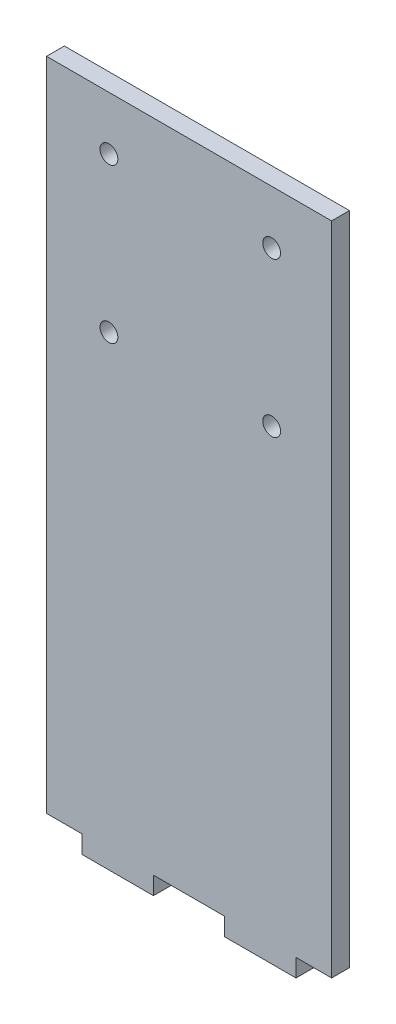
ISO-10303-21;
HEADER;
FILE_DESCRIPTION(('STEP AP214'),'2;1');
FILE_NAME('part.step','',(''),(''),'','','');
FILE_SCHEMA(('AUTOMOTIVE_DESIGN { 1 0 10303 214 1 1 1 1 }'));
ENDSEC;
DATA;
#1=APPLICATION_CONTEXT('core data for automotive mechanical design processes');
#2=APPLICATION_PROTOCOL_DEFINITION('international standard','automotive_design',2000,#1);
#3=PRODUCT_CONTEXT('',#1,'mechanical');
#4=PRODUCT('Part','Part','',(#3));
#5=PRODUCT_RELATED_PRODUCT_CATEGORY('part','',(#4));
#6=PRODUCT_DEFINITION_FORMATION('','',#4);
#7=PRODUCT_DEFINITION_CONTEXT('part definition',#1,'design');
#8=PRODUCT_DEFINITION('design','',#6,#7);
#9=PRODUCT_DEFINITION_SHAPE('','',#8);
#10=(LENGTH_UNIT() NAMED_UNIT(*) SI_UNIT(.MILLI.,.METRE.));
#11=(NAMED_UNIT(*) PLANE_ANGLE_UNIT() SI_UNIT($,.RADIAN.));
#12=(NAMED_UNIT(*) SI_UNIT($,.STERADIAN.) SOLID_ANGLE_UNIT());
#13=UNCERTAINTY_MEASURE_WITH_UNIT(LENGTH_MEASURE(1.E-05),#10,'distance_accuracy_value','');
#14=(GEOMETRIC_REPRESENTATION_CONTEXT(3) GLOBAL_UNCERTAINTY_ASSIGNED_CONTEXT((#13)) GLOBAL_UNIT_ASSIGNED_CONTEXT((#10,
#11,#12)) REPRESENTATION_CONTEXT('',''));
#15=CARTESIAN_POINT('',(0.,0.,0.));
#16=DIRECTION('',(0.,0.,1.));
#17=DIRECTION('',(1.,0.,0.));
#18=AXIS2_PLACEMENT_3D('',#15,#16,#17);
#19=CARTESIAN_POINT('',(50.8,0.,3.175));
#20=DIRECTION('',(-1.,0.,0.));
#21=DIRECTION('',(0.,-1.,0.));
#22=AXIS2_PLACEMENT_3D('',#19,#20,#21);
#23=PLANE('',#22);
#24=DIRECTION('',(0.,1.,0.));
#25=VECTOR('',#24,1.);
#26=CARTESIAN_POINT('',(50.8,0.,0.));
#27=LINE('',#26,#25);
#28=CARTESIAN_POINT('',(50.8,0.,0.));
#29=VERTEX_POINT('',#28);
#30=CARTESIAN_POINT('',(50.8,116.84,0.));
#31=VERTEX_POINT('',#30);
#32=EDGE_CURVE('E165',#29,#31,#27,.T.);
#33=ORIENTED_EDGE('',*,*,#32,.T.);
#34=DIRECTION('',(0.,0.,-1.));
#35=VECTOR('',#34,1.);
#36=CARTESIAN_POINT('',(50.8,116.84,3.175));
#37=LINE('',#36,#35);
#38=CARTESIAN_POINT('',(50.8,116.84,3.175));
#39=VERTEX_POINT('',#38);
#40=EDGE_CURVE('E11',#39,#31,#37,.T.);
#41=ORIENTED_EDGE('',*,*,#40,.F.);
#42=DIRECTION('',(0.,1.,0.));
#43=VECTOR('',#42,1.);
#44=CARTESIAN_POINT('',(50.8,0.,3.175));
#45=LINE('',#44,#43);
#46=CARTESIAN_POINT('',(50.8,0.,3.175));
#47=VERTEX_POINT('',#46);
#48=EDGE_CURVE('E100',#47,#39,#45,.T.);
#49=ORIENTED_EDGE('',*,*,#48,.F.);
#50=DIRECTION('',(0.,0.,-1.));
#51=VECTOR('',#50,1.);
#52=CARTESIAN_POINT('',(50.8,0.,3.175));
#53=LINE('',#52,#51);
#54=EDGE_CURVE('E149',#47,#29,#53,.T.);
#55=ORIENTED_EDGE('',*,*,#54,.T.);
#56=EDGE_LOOP('',(#33,#41,#49,#55));
#57=FACE_BOUND('',#56,.T.);
#58=ADVANCED_FACE('F35',(#57),#23,.F.);
#59=CARTESIAN_POINT('',(0.,116.84,3.175));
#60=DIRECTION('',(0.,1.,0.));
#61=DIRECTION('',(0.,0.,1.));
#62=AXIS2_PLACEMENT_3D('',#59,#60,#61);
#63=PLANE('',#62);
#64=DIRECTION('',(1.,0.,0.));
#65=VECTOR('',#64,1.);
#66=CARTESIAN_POINT('',(0.,116.84,0.));
#67=LINE('',#66,#65);
#68=CARTESIAN_POINT('',(0.,116.84,0.));
#69=VERTEX_POINT('',#68);
#70=EDGE_CURVE('E168',#69,#31,#67,.T.);
#71=ORIENTED_EDGE('',*,*,#70,.F.);
#72=DIRECTION('',(0.,0.,-1.));
#73=VECTOR('',#72,1.);
#74=CARTESIAN_POINT('',(0.,116.84,3.175));
#75=LINE('',#74,#73);
#76=CARTESIAN_POINT('',(0.,116.84,3.175));
#77=VERTEX_POINT('',#76);
#78=EDGE_CURVE('E44',#77,#69,#75,.T.);
#79=ORIENTED_EDGE('',*,*,#78,.F.);
#80=DIRECTION('',(1.,0.,0.));
#81=VECTOR('',#80,1.);
#82=CARTESIAN_POINT('',(0.,116.84,3.175));
#83=LINE('',#82,#81);
#84=EDGE_CURVE('E442',#77,#39,#83,.T.);
#85=ORIENTED_EDGE('',*,*,#84,.T.);
#86=ORIENTED_EDGE('',*,*,#40,.T.);
#87=EDGE_LOOP('',(#71,#79,#85,#86));
#88=FACE_BOUND('',#87,.T.);
#89=ADVANCED_FACE('F220',(#88),#63,.T.);
#90=CARTESIAN_POINT('',(0.,0.,3.175));
#91=DIRECTION('',(-1.,0.,0.));
#92=DIRECTION('',(0.,0.,1.));
#93=AXIS2_PLACEMENT_3D('',#90,#91,#92);
#94=PLANE('',#93);
#95=DIRECTION('',(0.,1.,0.));
#96=VECTOR('',#95,1.);
#97=CARTESIAN_POINT('',(0.,0.,0.));
#98=LINE('',#97,#96);
#99=CARTESIAN_POINT('',(0.,0.,0.));
#100=VERTEX_POINT('',#99);
#101=EDGE_CURVE('E171',#100,#69,#98,.T.);
#102=ORIENTED_EDGE('',*,*,#101,.F.);
#103=DIRECTION('',(0.,0.,-1.));
#104=VECTOR('',#103,1.);
#105=CARTESIAN_POINT('',(0.,0.,3.175));
#106=LINE('',#105,#104);
#107=CARTESIAN_POINT('',(0.,0.,3.175));
#108=VERTEX_POINT('',#107);
#109=EDGE_CURVE('E210',#108,#100,#106,.T.);
#110=ORIENTED_EDGE('',*,*,#109,.F.);
#111=DIRECTION('',(0.,1.,0.));
#112=VECTOR('',#111,1.);
#113=CARTESIAN_POINT('',(0.,0.,3.175));
#114=LINE('',#113,#112);
#115=EDGE_CURVE('E217',#108,#77,#114,.T.);
#116=ORIENTED_EDGE('',*,*,#115,.T.);
#117=ORIENTED_EDGE('',*,*,#78,.T.);
#118=EDGE_LOOP('',(#102,#110,#116,#117));
#119=FACE_BOUND('',#118,.T.);
#120=ADVANCED_FACE('F215',(#119),#94,.T.);
#121=CARTESIAN_POINT('',(0.,0.,3.175));
#122=DIRECTION('',(0.,1.,0.));
#123=DIRECTION('',(-1.,0.,0.));
#124=AXIS2_PLACEMENT_3D('',#121,#122,#123);
#125=PLANE('',#124);
#126=DIRECTION('',(1.,0.,0.));
#127=VECTOR('',#126,1.);
#128=CARTESIAN_POINT('',(0.,0.,0.));
#129=LINE('',#128,#127);
#130=CARTESIAN_POINT('',(6.35000000000001,0.,0.));
#131=VERTEX_POINT('',#130);
#132=EDGE_CURVE('E174',#100,#131,#129,.T.);
#133=ORIENTED_EDGE('',*,*,#132,.T.);
#134=DIRECTION('',(0.,0.,-1.));
#135=VECTOR('',#134,1.);
#136=CARTESIAN_POINT('',(6.35000000000001,0.,3.175));
#137=LINE('',#136,#135);
#138=CARTESIAN_POINT('',(6.35000000000001,0.,3.175));
#139=VERTEX_POINT('',#138);
#140=EDGE_CURVE('E207',#139,#131,#137,.T.);
#141=ORIENTED_EDGE('',*,*,#140,.F.);
#142=DIRECTION('',(1.,0.,0.));
#143=VECTOR('',#142,1.);
#144=CARTESIAN_POINT('',(0.,0.,3.175));
#145=LINE('',#144,#143);
#146=EDGE_CURVE('E238',#108,#139,#145,.T.);
#147=ORIENTED_EDGE('',*,*,#146,.F.);
#148=ORIENTED_EDGE('',*,*,#109,.T.);
#149=EDGE_LOOP('',(#133,#141,#147,#148));
#150=FACE_BOUND('',#149,.T.);
#151=ADVANCED_FACE('F229',(#150),#125,.F.);
#152=CARTESIAN_POINT('',(6.35000000000001,0.,3.175));
#153=DIRECTION('',(1.,0.,0.));
#154=DIRECTION('',(0.,0.,-1.));
#155=AXIS2_PLACEMENT_3D('',#152,#153,#154);
#156=PLANE('',#155);
#157=DIRECTION('',(0.,-1.,0.));
#158=VECTOR('',#157,1.);
#159=CARTESIAN_POINT('',(6.35000000000001,0.,0.));
#160=LINE('',#159,#158);
#161=CARTESIAN_POINT('',(6.35000000000001,-3.175,0.));
#162=VERTEX_POINT('',#161);
#163=EDGE_CURVE('E176',#131,#162,#160,.T.);
#164=ORIENTED_EDGE('',*,*,#163,.T.);
#165=DIRECTION('',(0.,0.,-1.));
#166=VECTOR('',#165,1.);
#167=CARTESIAN_POINT('',(6.35000000000001,-3.175,3.175));
#168=LINE('',#167,#166);
#169=CARTESIAN_POINT('',(6.35000000000001,-3.175,3.175));
#170=VERTEX_POINT('',#169);
#171=EDGE_CURVE('E204',#170,#162,#168,.T.);
#172=ORIENTED_EDGE('',*,*,#171,.F.);
#173=DIRECTION('',(0.,-1.,0.));
#174=VECTOR('',#173,1.);
#175=CARTESIAN_POINT('',(6.35000000000001,0.,3.175));
#176=LINE('',#175,#174);
#177=EDGE_CURVE('E235',#139,#170,#176,.T.);
#178=ORIENTED_EDGE('',*,*,#177,.F.);
#179=ORIENTED_EDGE('',*,*,#140,.T.);
#180=EDGE_LOOP('',(#164,#172,#178,#179));
#181=FACE_BOUND('',#180,.T.);
#182=ADVANCED_FACE('F233',(#181),#156,.F.);
#183=CARTESIAN_POINT('',(0.,-3.175,3.175));
#184=DIRECTION('',(0.,1.,0.));
#185=DIRECTION('',(0.,0.,1.));
#186=AXIS2_PLACEMENT_3D('',#183,#184,#185);
#187=PLANE('',#186);
#188=DIRECTION('',(1.,0.,0.));
#189=VECTOR('',#188,1.);
#190=CARTESIAN_POINT('',(0.,-3.175,0.));
#191=LINE('',#190,#189);
#192=CARTESIAN_POINT('',(19.05,-3.175,0.));
#193=VERTEX_POINT('',#192);
#194=EDGE_CURVE('E178',#162,#193,#191,.T.);
#195=ORIENTED_EDGE('',*,*,#194,.T.);
#196=DIRECTION('',(0.,0.,-1.));
#197=VECTOR('',#196,1.);
#198=CARTESIAN_POINT('',(19.05,-3.175,3.175));
#199=LINE('',#198,#197);
#200=CARTESIAN_POINT('',(19.05,-3.175,3.175));
#201=VERTEX_POINT('',#200);
#202=EDGE_CURVE('E201',#201,#193,#199,.T.);
#203=ORIENTED_EDGE('',*,*,#202,.F.);
#204=DIRECTION('',(1.,0.,0.));
#205=VECTOR('',#204,1.);
#206=CARTESIAN_POINT('',(0.,-3.175,3.175));
#207=LINE('',#206,#205);
#208=EDGE_CURVE('E237',#170,#201,#207,.T.);
#209=ORIENTED_EDGE('',*,*,#208,.F.);
#210=ORIENTED_EDGE('',*,*,#171,.T.);
#211=EDGE_LOOP('',(#195,#203,#209,#210));
#212=FACE_BOUND('',#211,.T.);
#213=ADVANCED_FACE('F376',(#212),#187,.F.);
#214=CARTESIAN_POINT('',(19.05,0.,3.175));
#215=DIRECTION('',(-1.,0.,0.));
#216=DIRECTION('',(0.,0.,1.));
#217=AXIS2_PLACEMENT_3D('',#214,#215,#216);
#218=PLANE('',#217);
#219=DIRECTION('',(0.,1.,0.));
#220=VECTOR('',#219,1.);
#221=CARTESIAN_POINT('',(19.05,0.,0.));
#222=LINE('',#221,#220);
#223=CARTESIAN_POINT('',(19.05,0.,0.));
#224=VERTEX_POINT('',#223);
#225=EDGE_CURVE('E180',#193,#224,#222,.T.);
#226=ORIENTED_EDGE('',*,*,#225,.T.);
#227=DIRECTION('',(0.,0.,-1.));
#228=VECTOR('',#227,1.);
#229=CARTESIAN_POINT('',(19.05,0.,3.175));
#230=LINE('',#229,#228);
#231=CARTESIAN_POINT('',(19.05,0.,3.175));
#232=VERTEX_POINT('',#231);
#233=EDGE_CURVE('E198',#232,#224,#230,.T.);
#234=ORIENTED_EDGE('',*,*,#233,.F.);
#235=DIRECTION('',(0.,1.,0.));
#236=VECTOR('',#235,1.);
#237=CARTESIAN_POINT('',(19.05,0.,3.175));
#238=LINE('',#237,#236);
#239=EDGE_CURVE('E240',#201,#232,#238,.T.);
#240=ORIENTED_EDGE('',*,*,#239,.F.);
#241=ORIENTED_EDGE('',*,*,#202,.T.);
#242=EDGE_LOOP('',(#226,#234,#240,#241));
#243=FACE_BOUND('',#242,.T.);
#244=ADVANCED_FACE('F366',(#243),#218,.F.);
#245=CARTESIAN_POINT('',(0.,0.,3.175));
#246=DIRECTION('',(0.,1.,0.));
#247=DIRECTION('',(-1.,0.,0.));
#248=AXIS2_PLACEMENT_3D('',#245,#246,#247);
#249=PLANE('',#248);
#250=DIRECTION('',(1.,0.,0.));
#251=VECTOR('',#250,1.);
#252=CARTESIAN_POINT('',(0.,0.,0.));
#253=LINE('',#252,#251);
#254=CARTESIAN_POINT('',(31.75,0.,0.));
#255=VERTEX_POINT('',#254);
#256=EDGE_CURVE('E182',#224,#255,#253,.T.);
#257=ORIENTED_EDGE('',*,*,#256,.T.);
#258=DIRECTION('',(0.,0.,-1.));
#259=VECTOR('',#258,1.);
#260=CARTESIAN_POINT('',(31.75,0.,3.175));
#261=LINE('',#260,#259);
#262=CARTESIAN_POINT('',(31.75,0.,3.175));
#263=VERTEX_POINT('',#262);
#264=EDGE_CURVE('E196',#263,#255,#261,.T.);
#265=ORIENTED_EDGE('',*,*,#264,.F.);
#266=DIRECTION('',(1.,0.,0.));
#267=VECTOR('',#266,1.);
#268=CARTESIAN_POINT('',(0.,0.,3.175));
#269=LINE('',#268,#267);
#270=EDGE_CURVE('E246',#232,#263,#269,.T.);
#271=ORIENTED_EDGE('',*,*,#270,.F.);
#272=ORIENTED_EDGE('',*,*,#233,.T.);
#273=EDGE_LOOP('',(#257,#265,#271,#272));
#274=FACE_BOUND('',#273,.T.);
#275=ADVANCED_FACE('F357',(#274),#249,.F.);
#276=CARTESIAN_POINT('',(31.75,0.,3.175));
#277=DIRECTION('',(-1.,0.,0.));
#278=DIRECTION('',(0.,-1.,0.));
#279=AXIS2_PLACEMENT_3D('',#276,#277,#278);
#280=PLANE('',#279);
#281=DIRECTION('',(0.,1.,0.));
#282=VECTOR('',#281,1.);
#283=CARTESIAN_POINT('',(31.75,0.,0.));
#284=LINE('',#283,#282);
#285=CARTESIAN_POINT('',(31.75,-3.175,0.));
#286=VERTEX_POINT('',#285);
#287=EDGE_CURVE('E185',#286,#255,#284,.T.);
#288=ORIENTED_EDGE('',*,*,#287,.F.);
#289=DIRECTION('',(0.,0.,-1.));
#290=VECTOR('',#289,1.);
#291=CARTESIAN_POINT('',(31.75,-3.175,3.175));
#292=LINE('',#291,#290);
#293=CARTESIAN_POINT('',(31.75,-3.175,3.175));
#294=VERTEX_POINT('',#293);
#295=EDGE_CURVE('E139',#294,#286,#292,.T.);
#296=ORIENTED_EDGE('',*,*,#295,.F.);
#297=DIRECTION('',(0.,1.,0.));
#298=VECTOR('',#297,1.);
#299=CARTESIAN_POINT('',(31.75,0.,3.175));
#300=LINE('',#299,#298);
#301=EDGE_CURVE('E145',#294,#263,#300,.T.);
#302=ORIENTED_EDGE('',*,*,#301,.T.);
#303=ORIENTED_EDGE('',*,*,#264,.T.);
#304=EDGE_LOOP('',(#288,#296,#302,#303));
#305=FACE_BOUND('',#304,.T.);
#306=ADVANCED_FACE('F249',(#305),#280,.T.);
#307=CARTESIAN_POINT('',(0.,-3.17500000000001,3.175));
#308=DIRECTION('',(0.,-1.,0.));
#309=DIRECTION('',(1.,0.,0.));
#310=AXIS2_PLACEMENT_3D('',#307,#308,#309);
#311=PLANE('',#310);
#312=DIRECTION('',(-1.,0.,0.));
#313=VECTOR('',#312,1.);
#314=CARTESIAN_POINT('',(0.,-3.17500000000001,0.));
#315=LINE('',#314,#313);
#316=CARTESIAN_POINT('',(44.45,-3.17499999999999,0.));
#317=VERTEX_POINT('',#316);
#318=EDGE_CURVE('E134',#317,#286,#315,.T.);
#319=ORIENTED_EDGE('',*,*,#318,.F.);
#320=DIRECTION('',(0.,0.,-1.));
#321=VECTOR('',#320,1.);
#322=CARTESIAN_POINT('',(44.45,-3.17499999999999,3.175));
#323=LINE('',#322,#321);
#324=CARTESIAN_POINT('',(44.45,-3.17499999999999,3.175));
#325=VERTEX_POINT('',#324);
#326=EDGE_CURVE('E129',#325,#317,#323,.T.);
#327=ORIENTED_EDGE('',*,*,#326,.F.);
#328=DIRECTION('',(-1.,0.,0.));
#329=VECTOR('',#328,1.);
#330=CARTESIAN_POINT('',(0.,-3.17500000000001,3.175));
#331=LINE('',#330,#329);
#332=EDGE_CURVE('E132',#325,#294,#331,.T.);
#333=ORIENTED_EDGE('',*,*,#332,.T.);
#334=ORIENTED_EDGE('',*,*,#295,.T.);
#335=EDGE_LOOP('',(#319,#327,#333,#334));
#336=FACE_BOUND('',#335,.T.);
#337=ADVANCED_FACE('F131',(#336),#311,.T.);
#338=CARTESIAN_POINT('',(44.45,0.,3.175));
#339=DIRECTION('',(1.,0.,0.));
#340=DIRECTION('',(0.,0.,-1.));
#341=AXIS2_PLACEMENT_3D('',#338,#339,#340);
#342=PLANE('',#341);
#343=DIRECTION('',(0.,-1.,0.));
#344=VECTOR('',#343,1.);
#345=CARTESIAN_POINT('',(44.45,0.,0.));
#346=LINE('',#345,#344);
#347=CARTESIAN_POINT('',(44.45,0.,0.));
#348=VERTEX_POINT('',#347);
#349=EDGE_CURVE('E189',#348,#317,#346,.T.);
#350=ORIENTED_EDGE('',*,*,#349,.F.);
#351=DIRECTION('',(0.,0.,-1.));
#352=VECTOR('',#351,1.);
#353=CARTESIAN_POINT('',(44.45,0.,3.175));
#354=LINE('',#353,#352);
#355=CARTESIAN_POINT('',(44.45,0.,3.175));
#356=VERTEX_POINT('',#355);
#357=EDGE_CURVE('E91',#356,#348,#354,.T.);
#358=ORIENTED_EDGE('',*,*,#357,.F.);
#359=DIRECTION('',(0.,-1.,0.));
#360=VECTOR('',#359,1.);
#361=CARTESIAN_POINT('',(44.45,0.,3.175));
#362=LINE('',#361,#360);
#363=EDGE_CURVE('E143',#356,#325,#362,.T.);
#364=ORIENTED_EDGE('',*,*,#363,.T.);
#365=ORIENTED_EDGE('',*,*,#326,.T.);
#366=EDGE_LOOP('',(#350,#358,#364,#365));
#367=FACE_BOUND('',#366,.T.);
#368=ADVANCED_FACE('F147',(#367),#342,.T.);
#369=CARTESIAN_POINT('',(40.1125,107.315,3.175));
#370=DIRECTION('',(0.,0.,-1.));
#371=DIRECTION('',(-1.,0.,0.));
#372=AXIS2_PLACEMENT_3D('',#369,#370,#371);
#373=CYLINDRICAL_SURFACE('',#372,1.5875);
#374=CARTESIAN_POINT('',(40.1125,107.315,3.175));
#375=DIRECTION('',(0.,0.,1.));
#376=DIRECTION('',(1.,0.,0.));
#377=AXIS2_PLACEMENT_3D('',#374,#375,#376);
#378=CIRCLE('',#377,1.5875);
#379=CARTESIAN_POINT('',(41.7,107.315,3.175));
#380=VERTEX_POINT('',#379);
#381=EDGE_CURVE('E434',#380,#380,#378,.T.);
#382=ORIENTED_EDGE('',*,*,#381,.T.);
#383=EDGE_LOOP('',(#382));
#384=FACE_BOUND('',#383,.T.);
#385=CARTESIAN_POINT('',(40.1125,107.315,0.));
#386=DIRECTION('',(0.,0.,1.));
#387=DIRECTION('',(1.,0.,0.));
#388=AXIS2_PLACEMENT_3D('',#385,#386,#387);
#389=CIRCLE('',#388,1.5875);
#390=CARTESIAN_POINT('',(41.7,107.315,0.));
#391=VERTEX_POINT('',#390);
#392=EDGE_CURVE('E162',#391,#391,#389,.T.);
#393=ORIENTED_EDGE('',*,*,#392,.F.);
#394=EDGE_LOOP('',(#393));
#395=FACE_BOUND('',#394,.T.);
#396=ADVANCED_FACE('F274',(#384,#395),#373,.F.);
#397=CARTESIAN_POINT('',(40.1125,79.815,3.175));
#398=DIRECTION('',(0.,0.,-1.));
#399=DIRECTION('',(-1.,0.,0.));
#400=AXIS2_PLACEMENT_3D('',#397,#398,#399);
#401=CYLINDRICAL_SURFACE('',#400,1.5875);
#402=CARTESIAN_POINT('',(40.1125,79.815,3.175));
#403=DIRECTION('',(0.,0.,1.));
#404=DIRECTION('',(1.,0.,0.));
#405=AXIS2_PLACEMENT_3D('',#402,#403,#404);
#406=CIRCLE('',#405,1.5875);
#407=CARTESIAN_POINT('',(41.7,79.815,3.175));
#408=VERTEX_POINT('',#407);
#409=EDGE_CURVE('E431',#408,#408,#406,.T.);
#410=ORIENTED_EDGE('',*,*,#409,.T.);
#411=EDGE_LOOP('',(#410));
#412=FACE_BOUND('',#411,.T.);
#413=CARTESIAN_POINT('',(40.1125,79.815,0.));
#414=DIRECTION('',(0.,0.,1.));
#415=DIRECTION('',(1.,0.,0.));
#416=AXIS2_PLACEMENT_3D('',#413,#414,#415);
#417=CIRCLE('',#416,1.5875);
#418=CARTESIAN_POINT('',(41.7,79.815,0.));
#419=VERTEX_POINT('',#418);
#420=EDGE_CURVE('E159',#419,#419,#417,.T.);
#421=ORIENTED_EDGE('',*,*,#420,.F.);
#422=EDGE_LOOP('',(#421));
#423=FACE_BOUND('',#422,.T.);
#424=ADVANCED_FACE('F277',(#412,#423),#401,.F.);
#425=CARTESIAN_POINT('',(11.1125,107.315,3.175));
#426=DIRECTION('',(0.,0.,-1.));
#427=DIRECTION('',(-1.,0.,0.));
#428=AXIS2_PLACEMENT_3D('',#425,#426,#427);
#429=CYLINDRICAL_SURFACE('',#428,1.5875);
#430=CARTESIAN_POINT('',(11.1125,107.315,3.175));
#431=DIRECTION('',(0.,0.,1.));
#432=DIRECTION('',(1.,0.,0.));
#433=AXIS2_PLACEMENT_3D('',#430,#431,#432);
#434=CIRCLE('',#433,1.5875);
#435=CARTESIAN_POINT('',(12.7,107.315,3.175));
#436=VERTEX_POINT('',#435);
#437=EDGE_CURVE('E288',#436,#436,#434,.T.);
#438=ORIENTED_EDGE('',*,*,#437,.T.);
#439=EDGE_LOOP('',(#438));
#440=FACE_BOUND('',#439,.T.);
#441=CARTESIAN_POINT('',(11.1125,107.315,0.));
#442=DIRECTION('',(0.,0.,1.));
#443=DIRECTION('',(1.,0.,0.));
#444=AXIS2_PLACEMENT_3D('',#441,#442,#443);
#445=CIRCLE('',#444,1.5875);
#446=CARTESIAN_POINT('',(12.7,107.315,0.));
#447=VERTEX_POINT('',#446);
#448=EDGE_CURVE('E156',#447,#447,#445,.T.);
#449=ORIENTED_EDGE('',*,*,#448,.F.);
#450=EDGE_LOOP('',(#449));
#451=FACE_BOUND('',#450,.T.);
#452=ADVANCED_FACE('F262',(#440,#451),#429,.F.);
#453=CARTESIAN_POINT('',(11.1125,79.815,3.175));
#454=DIRECTION('',(0.,0.,-1.));
#455=DIRECTION('',(-1.,0.,0.));
#456=AXIS2_PLACEMENT_3D('',#453,#454,#455);
#457=CYLINDRICAL_SURFACE('',#456,1.5875);
#458=CARTESIAN_POINT('',(11.1125,79.815,3.175));
#459=DIRECTION('',(0.,0.,1.));
#460=DIRECTION('',(1.,0.,0.));
#461=AXIS2_PLACEMENT_3D('',#458,#459,#460);
#462=CIRCLE('',#461,1.5875);
#463=CARTESIAN_POINT('',(12.7,79.815,3.175));
#464=VERTEX_POINT('',#463);
#465=EDGE_CURVE('E192',#464,#464,#462,.T.);
#466=ORIENTED_EDGE('',*,*,#465,.T.);
#467=EDGE_LOOP('',(#466));
#468=FACE_BOUND('',#467,.T.);
#469=CARTESIAN_POINT('',(11.1125,79.815,0.));
#470=DIRECTION('',(0.,0.,1.));
#471=DIRECTION('',(1.,0.,0.));
#472=AXIS2_PLACEMENT_3D('',#469,#470,#471);
#473=CIRCLE('',#472,1.5875);
#474=CARTESIAN_POINT('',(12.7,79.815,0.));
#475=VERTEX_POINT('',#474);
#476=EDGE_CURVE('E153',#475,#475,#473,.T.);
#477=ORIENTED_EDGE('',*,*,#476,.F.);
#478=EDGE_LOOP('',(#477));
#479=FACE_BOUND('',#478,.T.);
#480=ADVANCED_FACE('F37',(#468,#479),#457,.F.);
#481=CARTESIAN_POINT('',(0.,0.,3.175));
#482=DIRECTION('',(0.,1.,0.));
#483=DIRECTION('',(-1.,0.,0.));
#484=AXIS2_PLACEMENT_3D('',#481,#482,#483);
#485=PLANE('',#484);
#486=DIRECTION('',(1.,0.,0.));
#487=VECTOR('',#486,1.);
#488=CARTESIAN_POINT('',(0.,0.,0.));
#489=LINE('',#488,#487);
#490=EDGE_CURVE('E94',#348,#29,#489,.T.);
#491=ORIENTED_EDGE('',*,*,#490,.T.);
#492=ORIENTED_EDGE('',*,*,#54,.F.);
#493=DIRECTION('',(1.,0.,0.));
#494=VECTOR('',#493,1.);
#495=CARTESIAN_POINT('',(0.,0.,3.175));
#496=LINE('',#495,#494);
#497=EDGE_CURVE('E52',#356,#47,#496,.T.);
#498=ORIENTED_EDGE('',*,*,#497,.F.);
#499=ORIENTED_EDGE('',*,*,#357,.T.);
#500=EDGE_LOOP('',(#491,#492,#498,#499));
#501=FACE_BOUND('',#500,.T.);
#502=ADVANCED_FACE('F253',(#501),#485,.F.);
#503=CARTESIAN_POINT('',(0.,0.,3.175));
#504=DIRECTION('',(0.,0.,1.));
#505=DIRECTION('',(1.,0.,0.));
#506=AXIS2_PLACEMENT_3D('',#503,#504,#505);
#507=PLANE('',#506);
#508=ORIENTED_EDGE('',*,*,#465,.F.);
#509=EDGE_LOOP('',(#508));
#510=FACE_BOUND('',#509,.T.);
#511=ORIENTED_EDGE('',*,*,#437,.F.);
#512=EDGE_LOOP('',(#511));
#513=FACE_BOUND('',#512,.T.);
#514=ORIENTED_EDGE('',*,*,#409,.F.);
#515=EDGE_LOOP('',(#514));
#516=FACE_BOUND('',#515,.T.);
#517=ORIENTED_EDGE('',*,*,#381,.F.);
#518=EDGE_LOOP('',(#517));
#519=FACE_BOUND('',#518,.T.);
#520=ORIENTED_EDGE('',*,*,#48,.T.);
#521=ORIENTED_EDGE('',*,*,#84,.F.);
#522=ORIENTED_EDGE('',*,*,#115,.F.);
#523=ORIENTED_EDGE('',*,*,#146,.T.);
#524=ORIENTED_EDGE('',*,*,#177,.T.);
#525=ORIENTED_EDGE('',*,*,#208,.T.);
#526=ORIENTED_EDGE('',*,*,#239,.T.);
#527=ORIENTED_EDGE('',*,*,#270,.T.);
#528=ORIENTED_EDGE('',*,*,#301,.F.);
#529=ORIENTED_EDGE('',*,*,#332,.F.);
#530=ORIENTED_EDGE('',*,*,#363,.F.);
#531=ORIENTED_EDGE('',*,*,#497,.T.);
#532=EDGE_LOOP('',(#520,#521,#522,#523,#524,#525,#526,#527,#528,#529,#530,#531));
#533=FACE_BOUND('',#532,.T.);
#534=ADVANCED_FACE('F142',(#510,#513,#516,#519,#533),#507,.T.);
#535=CARTESIAN_POINT('',(0.,0.,0.));
#536=DIRECTION('',(0.,0.,1.));
#537=DIRECTION('',(1.,0.,0.));
#538=AXIS2_PLACEMENT_3D('',#535,#536,#537);
#539=PLANE('',#538);
#540=ORIENTED_EDGE('',*,*,#476,.T.);
#541=EDGE_LOOP('',(#540));
#542=FACE_BOUND('',#541,.T.);
#543=ORIENTED_EDGE('',*,*,#448,.T.);
#544=EDGE_LOOP('',(#543));
#545=FACE_BOUND('',#544,.T.);
#546=ORIENTED_EDGE('',*,*,#420,.T.);
#547=EDGE_LOOP('',(#546));
#548=FACE_BOUND('',#547,.T.);
#549=ORIENTED_EDGE('',*,*,#392,.T.);
#550=EDGE_LOOP('',(#549));
#551=FACE_BOUND('',#550,.T.);
#552=ORIENTED_EDGE('',*,*,#32,.F.);
#553=ORIENTED_EDGE('',*,*,#490,.F.);
#554=ORIENTED_EDGE('',*,*,#349,.T.);
#555=ORIENTED_EDGE('',*,*,#318,.T.);
#556=ORIENTED_EDGE('',*,*,#287,.T.);
#557=ORIENTED_EDGE('',*,*,#256,.F.);
#558=ORIENTED_EDGE('',*,*,#225,.F.);
#559=ORIENTED_EDGE('',*,*,#194,.F.);
#560=ORIENTED_EDGE('',*,*,#163,.F.);
#561=ORIENTED_EDGE('',*,*,#132,.F.);
#562=ORIENTED_EDGE('',*,*,#101,.T.);
#563=ORIENTED_EDGE('',*,*,#70,.T.);
#564=EDGE_LOOP('',(#552,#553,#554,#555,#556,#557,#558,#559,#560,#561,#562,#563));
#565=FACE_BOUND('',#564,.T.);
#566=ADVANCED_FACE('F224',(#542,#545,#548,#551,#565),#539,.F.);
#567=CLOSED_SHELL('',(#58,#89,#120,#151,#182,#213,#244,#275,#306,#337,#368,#396,#424,#452,#480,
#502,#534,#566));
#568=MANIFOLD_SOLID_BREP('B2',#567);
#569=ADVANCED_BREP_SHAPE_REPRESENTATION('',(#18,#568),#14);
#570=SHAPE_DEFINITION_REPRESENTATION(#9,#569);
ENDSEC;
END-ISO-10303-21;
